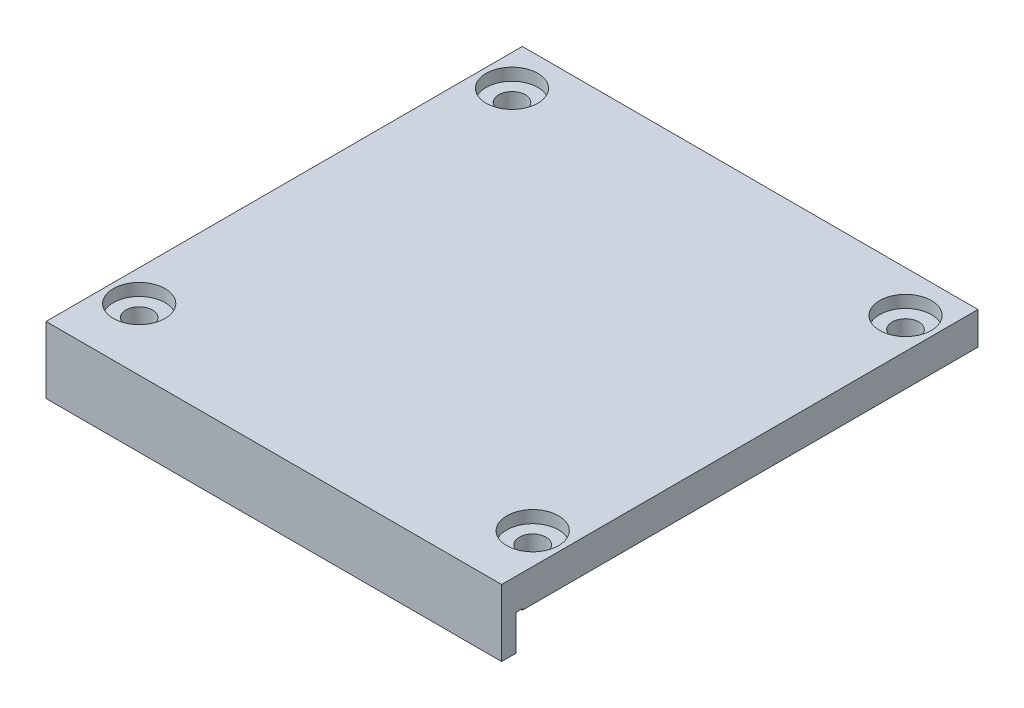
ISO-10303-21;
HEADER;
FILE_DESCRIPTION(('STEP AP214'),'2;1');
FILE_NAME('part.step','',(''),(''),'','','');
FILE_SCHEMA(('AUTOMOTIVE_DESIGN { 1 0 10303 214 1 1 1 1 }'));
ENDSEC;
DATA;
#1=APPLICATION_CONTEXT('core data for automotive mechanical design processes');
#2=APPLICATION_PROTOCOL_DEFINITION('international standard','automotive_design',2000,#1);
#3=PRODUCT_CONTEXT('',#1,'mechanical');
#4=PRODUCT('Part','Part','',(#3));
#5=PRODUCT_RELATED_PRODUCT_CATEGORY('part','',(#4));
#6=PRODUCT_DEFINITION_FORMATION('','',#4);
#7=PRODUCT_DEFINITION_CONTEXT('part definition',#1,'design');
#8=PRODUCT_DEFINITION('design','',#6,#7);
#9=PRODUCT_DEFINITION_SHAPE('','',#8);
#10=(LENGTH_UNIT() NAMED_UNIT(*) SI_UNIT(.MILLI.,.METRE.));
#11=(NAMED_UNIT(*) PLANE_ANGLE_UNIT() SI_UNIT($,.RADIAN.));
#12=(NAMED_UNIT(*) SI_UNIT($,.STERADIAN.) SOLID_ANGLE_UNIT());
#13=UNCERTAINTY_MEASURE_WITH_UNIT(LENGTH_MEASURE(1.E-05),#10,'distance_accuracy_value','');
#14=(GEOMETRIC_REPRESENTATION_CONTEXT(3) GLOBAL_UNCERTAINTY_ASSIGNED_CONTEXT((#13)) GLOBAL_UNIT_ASSIGNED_CONTEXT((#10,
#11,#12)) REPRESENTATION_CONTEXT('',''));
#15=CARTESIAN_POINT('',(0.,0.,0.));
#16=DIRECTION('',(0.,0.,1.));
#17=DIRECTION('',(1.,0.,0.));
#18=AXIS2_PLACEMENT_3D('',#15,#16,#17);
#19=CARTESIAN_POINT('',(27.94,4.,27.94));
#20=DIRECTION('',(-1.,0.,0.));
#21=DIRECTION('',(0.,0.,1.));
#22=AXIS2_PLACEMENT_3D('',#19,#20,#21);
#23=PLANE('',#22);
#24=DIRECTION('',(0.,0.,-1.));
#25=VECTOR('',#24,1.);
#26=CARTESIAN_POINT('',(27.94,-4.18457062596951,30.48));
#27=LINE('',#26,#25);
#28=CARTESIAN_POINT('',(27.94,-4.18457062596951,30.48));
#29=VERTEX_POINT('',#28);
#30=CARTESIAN_POINT('',(27.94,-4.18457062596951,28.702));
#31=VERTEX_POINT('',#30);
#32=EDGE_CURVE('E133',#29,#31,#27,.T.);
#33=ORIENTED_EDGE('',*,*,#32,.T.);
#34=DIRECTION('',(0.,-1.,0.));
#35=VECTOR('',#34,1.);
#36=CARTESIAN_POINT('',(27.94,-4.18457062596951,28.702));
#37=LINE('',#36,#35);
#38=CARTESIAN_POINT('',(27.94,0.164320888631053,28.702));
#39=VERTEX_POINT('',#38);
#40=EDGE_CURVE('E51',#39,#31,#37,.T.);
#41=ORIENTED_EDGE('',*,*,#40,.F.);
#42=DIRECTION('',(0.,0.,-1.));
#43=VECTOR('',#42,1.);
#44=CARTESIAN_POINT('',(27.94,0.164320888631053,28.702));
#45=LINE('',#44,#43);
#46=CARTESIAN_POINT('',(27.94,0.164320888631053,27.94));
#47=VERTEX_POINT('',#46);
#48=EDGE_CURVE('E139',#39,#47,#45,.T.);
#49=ORIENTED_EDGE('',*,*,#48,.T.);
#50=DIRECTION('',(0.,-1.,0.));
#51=VECTOR('',#50,1.);
#52=CARTESIAN_POINT('',(27.94,-4.18457062596951,27.94));
#53=LINE('',#52,#51);
#54=CARTESIAN_POINT('',(27.94,0.,27.94));
#55=VERTEX_POINT('',#54);
#56=EDGE_CURVE('E264',#47,#55,#53,.T.);
#57=ORIENTED_EDGE('',*,*,#56,.T.);
#58=DIRECTION('',(0.,0.,-1.));
#59=VECTOR('',#58,1.);
#60=CARTESIAN_POINT('',(27.94,0.,27.94));
#61=LINE('',#60,#59);
#62=CARTESIAN_POINT('',(27.94,0.,-27.94));
#63=VERTEX_POINT('',#62);
#64=EDGE_CURVE('E81',#55,#63,#61,.T.);
#65=ORIENTED_EDGE('',*,*,#64,.T.);
#66=DIRECTION('',(0.,-1.,0.));
#67=VECTOR('',#66,1.);
#68=CARTESIAN_POINT('',(27.94,4.,-27.94));
#69=LINE('',#68,#67);
#70=CARTESIAN_POINT('',(27.94,4.,-27.94));
#71=VERTEX_POINT('',#70);
#72=EDGE_CURVE('E11',#71,#63,#69,.T.);
#73=ORIENTED_EDGE('',*,*,#72,.F.);
#74=DIRECTION('',(0.,0.,-1.));
#75=VECTOR('',#74,1.);
#76=CARTESIAN_POINT('',(27.94,4.,27.94));
#77=LINE('',#76,#75);
#78=CARTESIAN_POINT('',(27.94,4.,30.48));
#79=VERTEX_POINT('',#78);
#80=EDGE_CURVE('E96',#79,#71,#77,.T.);
#81=ORIENTED_EDGE('',*,*,#80,.F.);
#82=DIRECTION('',(0.,1.,0.));
#83=VECTOR('',#82,1.);
#84=CARTESIAN_POINT('',(27.94,4.,30.48));
#85=LINE('',#84,#83);
#86=EDGE_CURVE('E132',#29,#79,#85,.T.);
#87=ORIENTED_EDGE('',*,*,#86,.F.);
#88=EDGE_LOOP('',(#33,#41,#49,#57,#65,#73,#81,#87));
#89=FACE_BOUND('',#88,.T.);
#90=ADVANCED_FACE('F35',(#89),#23,.F.);
#91=CARTESIAN_POINT('',(-27.94,4.,-27.94));
#92=DIRECTION('',(0.,0.,1.));
#93=DIRECTION('',(1.,0.,0.));
#94=AXIS2_PLACEMENT_3D('',#91,#92,#93);
#95=PLANE('',#94);
#96=DIRECTION('',(-1.,0.,0.));
#97=VECTOR('',#96,1.);
#98=CARTESIAN_POINT('',(-27.94,0.,-27.94));
#99=LINE('',#98,#97);
#100=CARTESIAN_POINT('',(-27.94,0.,-27.94));
#101=VERTEX_POINT('',#100);
#102=EDGE_CURVE('E71',#63,#101,#99,.T.);
#103=ORIENTED_EDGE('',*,*,#102,.T.);
#104=DIRECTION('',(0.,-1.,0.));
#105=VECTOR('',#104,1.);
#106=CARTESIAN_POINT('',(-27.94,4.,-27.94));
#107=LINE('',#106,#105);
#108=CARTESIAN_POINT('',(-27.94,4.,-27.94));
#109=VERTEX_POINT('',#108);
#110=EDGE_CURVE('E43',#109,#101,#107,.T.);
#111=ORIENTED_EDGE('',*,*,#110,.F.);
#112=DIRECTION('',(-1.,0.,0.));
#113=VECTOR('',#112,1.);
#114=CARTESIAN_POINT('',(-27.94,4.,-27.94));
#115=LINE('',#114,#113);
#116=EDGE_CURVE('E60',#71,#109,#115,.T.);
#117=ORIENTED_EDGE('',*,*,#116,.F.);
#118=ORIENTED_EDGE('',*,*,#72,.T.);
#119=EDGE_LOOP('',(#103,#111,#117,#118));
#120=FACE_BOUND('',#119,.T.);
#121=ADVANCED_FACE('F73',(#120),#95,.F.);
#122=CARTESIAN_POINT('',(-27.94,4.,27.94));
#123=DIRECTION('',(1.,0.,0.));
#124=DIRECTION('',(0.,0.,-1.));
#125=AXIS2_PLACEMENT_3D('',#122,#123,#124);
#126=PLANE('',#125);
#127=DIRECTION('',(0.,0.,-1.));
#128=VECTOR('',#127,1.);
#129=CARTESIAN_POINT('',(-27.94,0.164320888631053,28.702));
#130=LINE('',#129,#128);
#131=CARTESIAN_POINT('',(-27.94,0.164320888631053,28.702));
#132=VERTEX_POINT('',#131);
#133=CARTESIAN_POINT('',(-27.94,0.164320888631053,27.94));
#134=VERTEX_POINT('',#133);
#135=EDGE_CURVE('E143',#132,#134,#130,.T.);
#136=ORIENTED_EDGE('',*,*,#135,.F.);
#137=DIRECTION('',(0.,1.,0.));
#138=VECTOR('',#137,1.);
#139=CARTESIAN_POINT('',(-27.94,-4.18457062596951,28.702));
#140=LINE('',#139,#138);
#141=CARTESIAN_POINT('',(-27.94,-4.18457062596951,28.702));
#142=VERTEX_POINT('',#141);
#143=EDGE_CURVE('E253',#142,#132,#140,.T.);
#144=ORIENTED_EDGE('',*,*,#143,.F.);
#145=DIRECTION('',(0.,0.,-1.));
#146=VECTOR('',#145,1.);
#147=CARTESIAN_POINT('',(-27.94,-4.18457062596951,30.48));
#148=LINE('',#147,#146);
#149=CARTESIAN_POINT('',(-27.94,-4.18457062596951,30.48));
#150=VERTEX_POINT('',#149);
#151=EDGE_CURVE('E137',#150,#142,#148,.T.);
#152=ORIENTED_EDGE('',*,*,#151,.F.);
#153=DIRECTION('',(0.,-1.,0.));
#154=VECTOR('',#153,1.);
#155=CARTESIAN_POINT('',(-27.94,4.,30.48));
#156=LINE('',#155,#154);
#157=CARTESIAN_POINT('',(-27.94,4.,30.48));
#158=VERTEX_POINT('',#157);
#159=EDGE_CURVE('E129',#158,#150,#156,.T.);
#160=ORIENTED_EDGE('',*,*,#159,.F.);
#161=DIRECTION('',(0.,0.,1.));
#162=VECTOR('',#161,1.);
#163=CARTESIAN_POINT('',(-27.94,4.,27.94));
#164=LINE('',#163,#162);
#165=EDGE_CURVE('E91',#109,#158,#164,.T.);
#166=ORIENTED_EDGE('',*,*,#165,.F.);
#167=ORIENTED_EDGE('',*,*,#110,.T.);
#168=DIRECTION('',(0.,0.,1.));
#169=VECTOR('',#168,1.);
#170=CARTESIAN_POINT('',(-27.94,0.,27.94));
#171=LINE('',#170,#169);
#172=CARTESIAN_POINT('',(-27.94,0.,27.94));
#173=VERTEX_POINT('',#172);
#174=EDGE_CURVE('E80',#101,#173,#171,.T.);
#175=ORIENTED_EDGE('',*,*,#174,.T.);
#176=DIRECTION('',(0.,1.,0.));
#177=VECTOR('',#176,1.);
#178=CARTESIAN_POINT('',(-27.94,-4.18457062596951,27.94));
#179=LINE('',#178,#177);
#180=EDGE_CURVE('E146',#173,#134,#179,.T.);
#181=ORIENTED_EDGE('',*,*,#180,.T.);
#182=EDGE_LOOP('',(#136,#144,#152,#160,#166,#167,#175,#181));
#183=FACE_BOUND('',#182,.T.);
#184=ADVANCED_FACE('F86',(#183),#126,.F.);
#185=CARTESIAN_POINT('',(0.,4.,0.));
#186=DIRECTION('',(0.,-1.,0.));
#187=DIRECTION('',(0.,0.,-1.));
#188=AXIS2_PLACEMENT_3D('',#185,#186,#187);
#189=PLANE('',#188);
#190=CARTESIAN_POINT('',(-24.13,4.,-22.86));
#191=DIRECTION('',(0.,1.,0.));
#192=DIRECTION('',(0.,0.,1.));
#193=AXIS2_PLACEMENT_3D('',#190,#191,#192);
#194=CIRCLE('',#193,3.17499999999999);
#195=CARTESIAN_POINT('',(-24.13,4.,-19.685));
#196=VERTEX_POINT('',#195);
#197=EDGE_CURVE('E154',#196,#196,#194,.T.);
#198=ORIENTED_EDGE('',*,*,#197,.F.);
#199=EDGE_LOOP('',(#198));
#200=FACE_BOUND('',#199,.T.);
#201=CARTESIAN_POINT('',(24.13,4.,-22.86));
#202=DIRECTION('',(0.,1.,0.));
#203=DIRECTION('',(0.,0.,1.));
#204=AXIS2_PLACEMENT_3D('',#201,#202,#203);
#205=CIRCLE('',#204,3.17499999999999);
#206=CARTESIAN_POINT('',(24.13,4.,-19.685));
#207=VERTEX_POINT('',#206);
#208=EDGE_CURVE('E166',#207,#207,#205,.T.);
#209=ORIENTED_EDGE('',*,*,#208,.F.);
#210=EDGE_LOOP('',(#209));
#211=FACE_BOUND('',#210,.T.);
#212=CARTESIAN_POINT('',(24.13,4.,22.86));
#213=DIRECTION('',(0.,1.,0.));
#214=DIRECTION('',(0.,0.,1.));
#215=AXIS2_PLACEMENT_3D('',#212,#213,#214);
#216=CIRCLE('',#215,3.17499999999999);
#217=CARTESIAN_POINT('',(24.13,4.,26.035));
#218=VERTEX_POINT('',#217);
#219=EDGE_CURVE('E178',#218,#218,#216,.T.);
#220=ORIENTED_EDGE('',*,*,#219,.F.);
#221=EDGE_LOOP('',(#220));
#222=FACE_BOUND('',#221,.T.);
#223=CARTESIAN_POINT('',(-24.13,4.,22.86));
#224=DIRECTION('',(0.,1.,0.));
#225=DIRECTION('',(0.,0.,1.));
#226=AXIS2_PLACEMENT_3D('',#223,#224,#225);
#227=CIRCLE('',#226,3.17499999999999);
#228=CARTESIAN_POINT('',(-24.13,4.,26.035));
#229=VERTEX_POINT('',#228);
#230=EDGE_CURVE('E190',#229,#229,#227,.T.);
#231=ORIENTED_EDGE('',*,*,#230,.F.);
#232=EDGE_LOOP('',(#231));
#233=FACE_BOUND('',#232,.T.);
#234=ORIENTED_EDGE('',*,*,#80,.T.);
#235=ORIENTED_EDGE('',*,*,#116,.T.);
#236=ORIENTED_EDGE('',*,*,#165,.T.);
#237=DIRECTION('',(-1.,0.,0.));
#238=VECTOR('',#237,1.);
#239=CARTESIAN_POINT('',(-27.94,4.,30.48));
#240=LINE('',#239,#238);
#241=EDGE_CURVE('E122',#79,#158,#240,.T.);
#242=ORIENTED_EDGE('',*,*,#241,.F.);
#243=EDGE_LOOP('',(#234,#235,#236,#242));
#244=FACE_BOUND('',#243,.T.);
#245=ADVANCED_FACE('F120',(#200,#211,#222,#233,#244),#189,.F.);
#246=CARTESIAN_POINT('',(0.,0.,0.));
#247=DIRECTION('',(0.,-1.,0.));
#248=DIRECTION('',(0.,0.,-1.));
#249=AXIS2_PLACEMENT_3D('',#246,#247,#248);
#250=PLANE('',#249);
#251=CARTESIAN_POINT('',(-24.13,0.,-22.86));
#252=DIRECTION('',(0.,-1.,0.));
#253=DIRECTION('',(0.,0.,-1.));
#254=AXIS2_PLACEMENT_3D('',#251,#252,#253);
#255=CIRCLE('',#254,1.63195);
#256=CARTESIAN_POINT('',(-24.13,0.,-24.49195));
#257=VERTEX_POINT('',#256);
#258=EDGE_CURVE('E163',#257,#257,#255,.T.);
#259=ORIENTED_EDGE('',*,*,#258,.F.);
#260=EDGE_LOOP('',(#259));
#261=FACE_BOUND('',#260,.T.);
#262=CARTESIAN_POINT('',(24.13,0.,-22.86));
#263=DIRECTION('',(0.,-1.,0.));
#264=DIRECTION('',(0.,0.,-1.));
#265=AXIS2_PLACEMENT_3D('',#262,#263,#264);
#266=CIRCLE('',#265,1.63195);
#267=CARTESIAN_POINT('',(24.13,0.,-24.49195));
#268=VERTEX_POINT('',#267);
#269=EDGE_CURVE('E175',#268,#268,#266,.T.);
#270=ORIENTED_EDGE('',*,*,#269,.F.);
#271=EDGE_LOOP('',(#270));
#272=FACE_BOUND('',#271,.T.);
#273=CARTESIAN_POINT('',(24.13,0.,22.86));
#274=DIRECTION('',(0.,-1.,0.));
#275=DIRECTION('',(0.,0.,-1.));
#276=AXIS2_PLACEMENT_3D('',#273,#274,#275);
#277=CIRCLE('',#276,1.63195);
#278=CARTESIAN_POINT('',(24.13,0.,21.22805));
#279=VERTEX_POINT('',#278);
#280=EDGE_CURVE('E187',#279,#279,#277,.T.);
#281=ORIENTED_EDGE('',*,*,#280,.F.);
#282=EDGE_LOOP('',(#281));
#283=FACE_BOUND('',#282,.T.);
#284=CARTESIAN_POINT('',(-24.13,0.,22.86));
#285=DIRECTION('',(0.,-1.,0.));
#286=DIRECTION('',(0.,0.,-1.));
#287=AXIS2_PLACEMENT_3D('',#284,#285,#286);
#288=CIRCLE('',#287,1.63195);
#289=CARTESIAN_POINT('',(-24.13,0.,21.22805));
#290=VERTEX_POINT('',#289);
#291=EDGE_CURVE('E104',#290,#290,#288,.T.);
#292=ORIENTED_EDGE('',*,*,#291,.F.);
#293=EDGE_LOOP('',(#292));
#294=FACE_BOUND('',#293,.T.);
#295=ORIENTED_EDGE('',*,*,#64,.F.);
#296=DIRECTION('',(1.,0.,0.));
#297=VECTOR('',#296,1.);
#298=CARTESIAN_POINT('',(-27.94,0.,27.94));
#299=LINE('',#298,#297);
#300=EDGE_CURVE('E95',#173,#55,#299,.T.);
#301=ORIENTED_EDGE('',*,*,#300,.F.);
#302=ORIENTED_EDGE('',*,*,#174,.F.);
#303=ORIENTED_EDGE('',*,*,#102,.F.);
#304=EDGE_LOOP('',(#295,#301,#302,#303));
#305=FACE_BOUND('',#304,.T.);
#306=ADVANCED_FACE('F93',(#261,#272,#283,#294,#305),#250,.T.);
#307=CARTESIAN_POINT('',(-24.13,4.,22.86));
#308=DIRECTION('',(0.,1.,0.));
#309=DIRECTION('',(0.,0.,1.));
#310=AXIS2_PLACEMENT_3D('',#307,#308,#309);
#311=CYLINDRICAL_SURFACE('',#310,1.63195);
#312=CARTESIAN_POINT('',(-24.13,2.5014,22.86));
#313=DIRECTION('',(0.,1.,0.));
#314=DIRECTION('',(0.,0.,1.));
#315=AXIS2_PLACEMENT_3D('',#312,#313,#314);
#316=CIRCLE('',#315,1.63195);
#317=CARTESIAN_POINT('',(-24.13,2.5014,24.49195));
#318=VERTEX_POINT('',#317);
#319=EDGE_CURVE('E108',#318,#318,#316,.T.);
#320=ORIENTED_EDGE('',*,*,#319,.T.);
#321=EDGE_LOOP('',(#320));
#322=FACE_BOUND('',#321,.T.);
#323=ORIENTED_EDGE('',*,*,#291,.T.);
#324=EDGE_LOOP('',(#323));
#325=FACE_BOUND('',#324,.T.);
#326=ADVANCED_FACE('F212',(#322,#325),#311,.F.);
#327=CARTESIAN_POINT('',(-22.49805,2.5014,22.86));
#328=DIRECTION('',(0.,-1.,0.));
#329=DIRECTION('',(0.,0.,-1.));
#330=AXIS2_PLACEMENT_3D('',#327,#328,#329);
#331=PLANE('',#330);
#332=ORIENTED_EDGE('',*,*,#319,.F.);
#333=EDGE_LOOP('',(#332));
#334=FACE_BOUND('',#333,.T.);
#335=CARTESIAN_POINT('',(-24.13,2.5014,22.86));
#336=DIRECTION('',(0.,1.,0.));
#337=DIRECTION('',(0.,0.,1.));
#338=AXIS2_PLACEMENT_3D('',#335,#336,#337);
#339=CIRCLE('',#338,3.175);
#340=CARTESIAN_POINT('',(-24.13,2.5014,26.035));
#341=VERTEX_POINT('',#340);
#342=EDGE_CURVE('E113',#341,#341,#339,.T.);
#343=ORIENTED_EDGE('',*,*,#342,.T.);
#344=EDGE_LOOP('',(#343));
#345=FACE_BOUND('',#344,.T.);
#346=ADVANCED_FACE('F195',(#334,#345),#331,.F.);
#347=CARTESIAN_POINT('',(-24.13,4.,22.86));
#348=DIRECTION('',(0.,1.,0.));
#349=DIRECTION('',(0.,0.,1.));
#350=AXIS2_PLACEMENT_3D('',#347,#348,#349);
#351=CYLINDRICAL_SURFACE('',#350,3.175);
#352=ORIENTED_EDGE('',*,*,#342,.F.);
#353=EDGE_LOOP('',(#352));
#354=FACE_BOUND('',#353,.T.);
#355=ORIENTED_EDGE('',*,*,#230,.T.);
#356=EDGE_LOOP('',(#355));
#357=FACE_BOUND('',#356,.T.);
#358=ADVANCED_FACE('F197',(#354,#357),#351,.F.);
#359=CARTESIAN_POINT('',(24.13,4.,22.86));
#360=DIRECTION('',(0.,1.,0.));
#361=DIRECTION('',(0.,0.,1.));
#362=AXIS2_PLACEMENT_3D('',#359,#360,#361);
#363=CYLINDRICAL_SURFACE('',#362,1.63195);
#364=CARTESIAN_POINT('',(24.13,2.5014,22.86));
#365=DIRECTION('',(0.,1.,0.));
#366=DIRECTION('',(0.,0.,1.));
#367=AXIS2_PLACEMENT_3D('',#364,#365,#366);
#368=CIRCLE('',#367,1.63195);
#369=CARTESIAN_POINT('',(24.13,2.5014,24.49195));
#370=VERTEX_POINT('',#369);
#371=EDGE_CURVE('E184',#370,#370,#368,.T.);
#372=ORIENTED_EDGE('',*,*,#371,.T.);
#373=EDGE_LOOP('',(#372));
#374=FACE_BOUND('',#373,.T.);
#375=ORIENTED_EDGE('',*,*,#280,.T.);
#376=EDGE_LOOP('',(#375));
#377=FACE_BOUND('',#376,.T.);
#378=ADVANCED_FACE('F200',(#374,#377),#363,.F.);
#379=CARTESIAN_POINT('',(25.76195,2.5014,22.86));
#380=DIRECTION('',(0.,-1.,0.));
#381=DIRECTION('',(0.,0.,-1.));
#382=AXIS2_PLACEMENT_3D('',#379,#380,#381);
#383=PLANE('',#382);
#384=ORIENTED_EDGE('',*,*,#371,.F.);
#385=EDGE_LOOP('',(#384));
#386=FACE_BOUND('',#385,.T.);
#387=CARTESIAN_POINT('',(24.13,2.5014,22.86));
#388=DIRECTION('',(0.,1.,0.));
#389=DIRECTION('',(0.,0.,1.));
#390=AXIS2_PLACEMENT_3D('',#387,#388,#389);
#391=CIRCLE('',#390,3.175);
#392=CARTESIAN_POINT('',(24.13,2.5014,26.035));
#393=VERTEX_POINT('',#392);
#394=EDGE_CURVE('E181',#393,#393,#391,.T.);
#395=ORIENTED_EDGE('',*,*,#394,.T.);
#396=EDGE_LOOP('',(#395));
#397=FACE_BOUND('',#396,.T.);
#398=ADVANCED_FACE('F310',(#386,#397),#383,.F.);
#399=CARTESIAN_POINT('',(24.13,4.,22.86));
#400=DIRECTION('',(0.,1.,0.));
#401=DIRECTION('',(0.,0.,1.));
#402=AXIS2_PLACEMENT_3D('',#399,#400,#401);
#403=CYLINDRICAL_SURFACE('',#402,3.175);
#404=ORIENTED_EDGE('',*,*,#394,.F.);
#405=EDGE_LOOP('',(#404));
#406=FACE_BOUND('',#405,.T.);
#407=ORIENTED_EDGE('',*,*,#219,.T.);
#408=EDGE_LOOP('',(#407));
#409=FACE_BOUND('',#408,.T.);
#410=ADVANCED_FACE('F306',(#406,#409),#403,.F.);
#411=CARTESIAN_POINT('',(24.13,4.,-22.86));
#412=DIRECTION('',(0.,1.,0.));
#413=DIRECTION('',(0.,0.,1.));
#414=AXIS2_PLACEMENT_3D('',#411,#412,#413);
#415=CYLINDRICAL_SURFACE('',#414,1.63195);
#416=CARTESIAN_POINT('',(24.13,2.5014,-22.86));
#417=DIRECTION('',(0.,1.,0.));
#418=DIRECTION('',(0.,0.,1.));
#419=AXIS2_PLACEMENT_3D('',#416,#417,#418);
#420=CIRCLE('',#419,1.63195);
#421=CARTESIAN_POINT('',(24.13,2.5014,-21.22805));
#422=VERTEX_POINT('',#421);
#423=EDGE_CURVE('E172',#422,#422,#420,.T.);
#424=ORIENTED_EDGE('',*,*,#423,.T.);
#425=EDGE_LOOP('',(#424));
#426=FACE_BOUND('',#425,.T.);
#427=ORIENTED_EDGE('',*,*,#269,.T.);
#428=EDGE_LOOP('',(#427));
#429=FACE_BOUND('',#428,.T.);
#430=ADVANCED_FACE('F302',(#426,#429),#415,.F.);
#431=CARTESIAN_POINT('',(25.76195,2.5014,-22.86));
#432=DIRECTION('',(0.,-1.,0.));
#433=DIRECTION('',(0.,0.,-1.));
#434=AXIS2_PLACEMENT_3D('',#431,#432,#433);
#435=PLANE('',#434);
#436=ORIENTED_EDGE('',*,*,#423,.F.);
#437=EDGE_LOOP('',(#436));
#438=FACE_BOUND('',#437,.T.);
#439=CARTESIAN_POINT('',(24.13,2.5014,-22.86));
#440=DIRECTION('',(0.,1.,0.));
#441=DIRECTION('',(0.,0.,1.));
#442=AXIS2_PLACEMENT_3D('',#439,#440,#441);
#443=CIRCLE('',#442,3.175);
#444=CARTESIAN_POINT('',(24.13,2.5014,-19.685));
#445=VERTEX_POINT('',#444);
#446=EDGE_CURVE('E169',#445,#445,#443,.T.);
#447=ORIENTED_EDGE('',*,*,#446,.T.);
#448=EDGE_LOOP('',(#447));
#449=FACE_BOUND('',#448,.T.);
#450=ADVANCED_FACE('F298',(#438,#449),#435,.F.);
#451=CARTESIAN_POINT('',(24.13,4.,-22.86));
#452=DIRECTION('',(0.,1.,0.));
#453=DIRECTION('',(0.,0.,1.));
#454=AXIS2_PLACEMENT_3D('',#451,#452,#453);
#455=CYLINDRICAL_SURFACE('',#454,3.175);
#456=ORIENTED_EDGE('',*,*,#446,.F.);
#457=EDGE_LOOP('',(#456));
#458=FACE_BOUND('',#457,.T.);
#459=ORIENTED_EDGE('',*,*,#208,.T.);
#460=EDGE_LOOP('',(#459));
#461=FACE_BOUND('',#460,.T.);
#462=ADVANCED_FACE('F294',(#458,#461),#455,.F.);
#463=CARTESIAN_POINT('',(-24.13,4.,-22.86));
#464=DIRECTION('',(0.,1.,0.));
#465=DIRECTION('',(0.,0.,1.));
#466=AXIS2_PLACEMENT_3D('',#463,#464,#465);
#467=CYLINDRICAL_SURFACE('',#466,1.63195);
#468=CARTESIAN_POINT('',(-24.13,2.5014,-22.86));
#469=DIRECTION('',(0.,1.,0.));
#470=DIRECTION('',(0.,0.,1.));
#471=AXIS2_PLACEMENT_3D('',#468,#469,#470);
#472=CIRCLE('',#471,1.63195);
#473=CARTESIAN_POINT('',(-24.13,2.5014,-21.22805));
#474=VERTEX_POINT('',#473);
#475=EDGE_CURVE('E160',#474,#474,#472,.T.);
#476=ORIENTED_EDGE('',*,*,#475,.T.);
#477=EDGE_LOOP('',(#476));
#478=FACE_BOUND('',#477,.T.);
#479=ORIENTED_EDGE('',*,*,#258,.T.);
#480=EDGE_LOOP('',(#479));
#481=FACE_BOUND('',#480,.T.);
#482=ADVANCED_FACE('F290',(#478,#481),#467,.F.);
#483=CARTESIAN_POINT('',(-22.49805,2.5014,-22.86));
#484=DIRECTION('',(0.,-1.,0.));
#485=DIRECTION('',(0.,0.,-1.));
#486=AXIS2_PLACEMENT_3D('',#483,#484,#485);
#487=PLANE('',#486);
#488=ORIENTED_EDGE('',*,*,#475,.F.);
#489=EDGE_LOOP('',(#488));
#490=FACE_BOUND('',#489,.T.);
#491=CARTESIAN_POINT('',(-24.13,2.5014,-22.86));
#492=DIRECTION('',(0.,1.,0.));
#493=DIRECTION('',(0.,0.,1.));
#494=AXIS2_PLACEMENT_3D('',#491,#492,#493);
#495=CIRCLE('',#494,3.175);
#496=CARTESIAN_POINT('',(-24.13,2.5014,-19.685));
#497=VERTEX_POINT('',#496);
#498=EDGE_CURVE('E157',#497,#497,#495,.T.);
#499=ORIENTED_EDGE('',*,*,#498,.T.);
#500=EDGE_LOOP('',(#499));
#501=FACE_BOUND('',#500,.T.);
#502=ADVANCED_FACE('F286',(#490,#501),#487,.F.);
#503=CARTESIAN_POINT('',(-24.13,4.,-22.86));
#504=DIRECTION('',(0.,1.,0.));
#505=DIRECTION('',(0.,0.,1.));
#506=AXIS2_PLACEMENT_3D('',#503,#504,#505);
#507=CYLINDRICAL_SURFACE('',#506,3.175);
#508=ORIENTED_EDGE('',*,*,#498,.F.);
#509=EDGE_LOOP('',(#508));
#510=FACE_BOUND('',#509,.T.);
#511=ORIENTED_EDGE('',*,*,#197,.T.);
#512=EDGE_LOOP('',(#511));
#513=FACE_BOUND('',#512,.T.);
#514=ADVANCED_FACE('F284',(#510,#513),#507,.F.);
#515=CARTESIAN_POINT('',(-27.94,-4.18457062596951,30.48));
#516=DIRECTION('',(0.,1.,0.));
#517=DIRECTION('',(0.,0.,1.));
#518=AXIS2_PLACEMENT_3D('',#515,#516,#517);
#519=PLANE('',#518);
#520=ORIENTED_EDGE('',*,*,#151,.T.);
#521=DIRECTION('',(-1.,0.,0.));
#522=VECTOR('',#521,1.);
#523=CARTESIAN_POINT('',(27.94,-4.18457062596951,28.702));
#524=LINE('',#523,#522);
#525=EDGE_CURVE('E231',#31,#142,#524,.T.);
#526=ORIENTED_EDGE('',*,*,#525,.F.);
#527=ORIENTED_EDGE('',*,*,#32,.F.);
#528=DIRECTION('',(1.,0.,0.));
#529=VECTOR('',#528,1.);
#530=CARTESIAN_POINT('',(-27.94,-4.18457062596951,30.48));
#531=LINE('',#530,#529);
#532=EDGE_CURVE('E138',#150,#29,#531,.T.);
#533=ORIENTED_EDGE('',*,*,#532,.F.);
#534=EDGE_LOOP('',(#520,#526,#527,#533));
#535=FACE_BOUND('',#534,.T.);
#536=ADVANCED_FACE('F230',(#535),#519,.F.);
#537=CARTESIAN_POINT('',(0.,0.,30.48));
#538=DIRECTION('',(0.,0.,1.));
#539=DIRECTION('',(1.,0.,0.));
#540=AXIS2_PLACEMENT_3D('',#537,#538,#539);
#541=PLANE('',#540);
#542=ORIENTED_EDGE('',*,*,#159,.T.);
#543=ORIENTED_EDGE('',*,*,#532,.T.);
#544=ORIENTED_EDGE('',*,*,#86,.T.);
#545=ORIENTED_EDGE('',*,*,#241,.T.);
#546=EDGE_LOOP('',(#542,#543,#544,#545));
#547=FACE_BOUND('',#546,.T.);
#548=ADVANCED_FACE('F126',(#547),#541,.T.);
#549=CARTESIAN_POINT('',(27.94,0.164320888631053,28.702));
#550=DIRECTION('',(0.,1.,0.));
#551=DIRECTION('',(0.,0.,1.));
#552=AXIS2_PLACEMENT_3D('',#549,#550,#551);
#553=PLANE('',#552);
#554=DIRECTION('',(1.,0.,0.));
#555=VECTOR('',#554,1.);
#556=CARTESIAN_POINT('',(27.94,0.164320888631053,27.94));
#557=LINE('',#556,#555);
#558=EDGE_CURVE('E266',#134,#47,#557,.T.);
#559=ORIENTED_EDGE('',*,*,#558,.T.);
#560=ORIENTED_EDGE('',*,*,#48,.F.);
#561=DIRECTION('',(1.,0.,0.));
#562=VECTOR('',#561,1.);
#563=CARTESIAN_POINT('',(27.94,0.164320888631053,28.702));
#564=LINE('',#563,#562);
#565=EDGE_CURVE('E256',#132,#39,#564,.T.);
#566=ORIENTED_EDGE('',*,*,#565,.F.);
#567=ORIENTED_EDGE('',*,*,#135,.T.);
#568=EDGE_LOOP('',(#559,#560,#566,#567));
#569=FACE_BOUND('',#568,.T.);
#570=ADVANCED_FACE('F272',(#569),#553,.F.);
#571=CARTESIAN_POINT('',(0.,0.,28.702));
#572=DIRECTION('',(0.,0.,1.));
#573=DIRECTION('',(1.,0.,0.));
#574=AXIS2_PLACEMENT_3D('',#571,#572,#573);
#575=PLANE('',#574);
#576=ORIENTED_EDGE('',*,*,#40,.T.);
#577=ORIENTED_EDGE('',*,*,#525,.T.);
#578=ORIENTED_EDGE('',*,*,#143,.T.);
#579=ORIENTED_EDGE('',*,*,#565,.T.);
#580=EDGE_LOOP('',(#576,#577,#578,#579));
#581=FACE_BOUND('',#580,.T.);
#582=ADVANCED_FACE('F252',(#581),#575,.F.);
#583=CARTESIAN_POINT('',(0.,0.,27.94));
#584=DIRECTION('',(0.,0.,1.));
#585=DIRECTION('',(1.,0.,0.));
#586=AXIS2_PLACEMENT_3D('',#583,#584,#585);
#587=PLANE('',#586);
#588=ORIENTED_EDGE('',*,*,#56,.F.);
#589=ORIENTED_EDGE('',*,*,#558,.F.);
#590=ORIENTED_EDGE('',*,*,#180,.F.);
#591=ORIENTED_EDGE('',*,*,#300,.T.);
#592=EDGE_LOOP('',(#588,#589,#590,#591));
#593=FACE_BOUND('',#592,.T.);
#594=ADVANCED_FACE('F271',(#593),#587,.T.);
#595=CLOSED_SHELL('',(#90,#121,#184,#245,#306,#326,#346,#358,#378,#398,#410,#430,#450,#462,#482,
#502,#514,#536,#548,#570,#582,#594));
#596=MANIFOLD_SOLID_BREP('B2',#595);
#597=ADVANCED_BREP_SHAPE_REPRESENTATION('',(#18,#596),#14);
#598=SHAPE_DEFINITION_REPRESENTATION(#9,#597);
ENDSEC;
END-ISO-10303-21;
